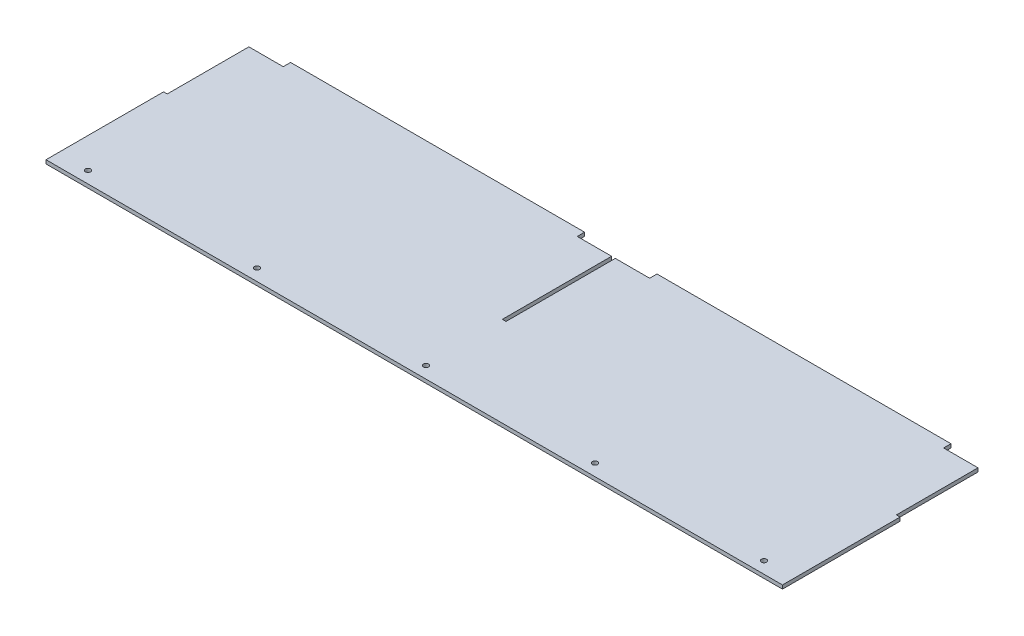
ISO-10303-21;
HEADER;
FILE_DESCRIPTION(('STEP AP214'),'2;1');
FILE_NAME('part.step','',(''),(''),'','','');
FILE_SCHEMA(('AUTOMOTIVE_DESIGN { 1 0 10303 214 1 1 1 1 }'));
ENDSEC;
DATA;
#1=APPLICATION_CONTEXT('core data for automotive mechanical design processes');
#2=APPLICATION_PROTOCOL_DEFINITION('international standard','automotive_design',2000,#1);
#3=PRODUCT_CONTEXT('',#1,'mechanical');
#4=PRODUCT('Part','Part','',(#3));
#5=PRODUCT_RELATED_PRODUCT_CATEGORY('part','',(#4));
#6=PRODUCT_DEFINITION_FORMATION('','',#4);
#7=PRODUCT_DEFINITION_CONTEXT('part definition',#1,'design');
#8=PRODUCT_DEFINITION('design','',#6,#7);
#9=PRODUCT_DEFINITION_SHAPE('','',#8);
#10=(LENGTH_UNIT() NAMED_UNIT(*) SI_UNIT(.MILLI.,.METRE.));
#11=(NAMED_UNIT(*) PLANE_ANGLE_UNIT() SI_UNIT($,.RADIAN.));
#12=(NAMED_UNIT(*) SI_UNIT($,.STERADIAN.) SOLID_ANGLE_UNIT());
#13=UNCERTAINTY_MEASURE_WITH_UNIT(LENGTH_MEASURE(1.E-05),#10,'distance_accuracy_value','');
#14=(GEOMETRIC_REPRESENTATION_CONTEXT(3) GLOBAL_UNCERTAINTY_ASSIGNED_CONTEXT((#13)) GLOBAL_UNIT_ASSIGNED_CONTEXT((#10,
#11,#12)) REPRESENTATION_CONTEXT('',''));
#15=CARTESIAN_POINT('',(0.,0.,0.));
#16=DIRECTION('',(0.,0.,1.));
#17=DIRECTION('',(1.,0.,0.));
#18=AXIS2_PLACEMENT_3D('',#15,#16,#17);
#19=CARTESIAN_POINT('',(629.90984,3.175,0.));
#20=DIRECTION('',(-1.,0.,0.));
#21=DIRECTION('',(0.,0.,-1.));
#22=AXIS2_PLACEMENT_3D('',#19,#20,#21);
#23=PLANE('',#22);
#24=DIRECTION('',(0.,0.,-1.));
#25=VECTOR('',#24,1.);
#26=CARTESIAN_POINT('',(629.90984,3.175,0.));
#27=LINE('',#26,#25);
#28=CARTESIAN_POINT('',(629.90984,3.175,-77.20584));
#29=VERTEX_POINT('',#28);
#30=CARTESIAN_POINT('',(629.90984,3.175,-147.69846));
#31=VERTEX_POINT('',#30);
#32=EDGE_CURVE('E259',#29,#31,#27,.T.);
#33=ORIENTED_EDGE('',*,*,#32,.F.);
#34=DIRECTION('',(0.,-1.,0.));
#35=VECTOR('',#34,1.);
#36=CARTESIAN_POINT('',(629.90984,3.175,-77.20584));
#37=LINE('',#36,#35);
#38=CARTESIAN_POINT('',(629.90984,0.,-77.20584));
#39=VERTEX_POINT('',#38);
#40=EDGE_CURVE('E218',#29,#39,#37,.T.);
#41=ORIENTED_EDGE('',*,*,#40,.T.);
#42=DIRECTION('',(0.,0.,-1.));
#43=VECTOR('',#42,1.);
#44=CARTESIAN_POINT('',(629.90984,0.,0.));
#45=LINE('',#44,#43);
#46=CARTESIAN_POINT('',(629.90984,0.,-147.69846));
#47=VERTEX_POINT('',#46);
#48=EDGE_CURVE('E284',#39,#47,#45,.T.);
#49=ORIENTED_EDGE('',*,*,#48,.T.);
#50=DIRECTION('',(0.,1.,0.));
#51=VECTOR('',#50,1.);
#52=CARTESIAN_POINT('',(629.90984,3.175,-147.69846));
#53=LINE('',#52,#51);
#54=EDGE_CURVE('E319',#47,#31,#53,.T.);
#55=ORIENTED_EDGE('',*,*,#54,.T.);
#56=EDGE_LOOP('',(#33,#41,#49,#55));
#57=FACE_BOUND('',#56,.T.);
#58=ADVANCED_FACE('F39',(#57),#23,.F.);
#59=CARTESIAN_POINT('',(313.36742,3.175,-53.3320399735148));
#60=DIRECTION('',(0.,0.,-1.));
#61=DIRECTION('',(1.,0.,0.));
#62=AXIS2_PLACEMENT_3D('',#59,#60,#61);
#63=PLANE('',#62);
#64=DIRECTION('',(0.,1.,0.));
#65=VECTOR('',#64,1.);
#66=CARTESIAN_POINT('',(316.54242,3.175,-53.3320399735148));
#67=LINE('',#66,#65);
#68=CARTESIAN_POINT('',(316.54242,0.,-53.3320399735148));
#69=VERTEX_POINT('',#68);
#70=CARTESIAN_POINT('',(316.54242,3.175,-53.3320399735148));
#71=VERTEX_POINT('',#70);
#72=EDGE_CURVE('E11',#69,#71,#67,.T.);
#73=ORIENTED_EDGE('',*,*,#72,.F.);
#74=DIRECTION('',(1.,0.,0.));
#75=VECTOR('',#74,1.);
#76=CARTESIAN_POINT('',(0.,0.,-53.3320399735148));
#77=LINE('',#76,#75);
#78=CARTESIAN_POINT('',(313.36742,0.,-53.3320399735148));
#79=VERTEX_POINT('',#78);
#80=EDGE_CURVE('E306',#79,#69,#77,.T.);
#81=ORIENTED_EDGE('',*,*,#80,.F.);
#82=DIRECTION('',(0.,1.,0.));
#83=VECTOR('',#82,1.);
#84=CARTESIAN_POINT('',(313.36742,3.175,-53.3320399735148));
#85=LINE('',#84,#83);
#86=CARTESIAN_POINT('',(313.36742,3.175,-53.3320399735148));
#87=VERTEX_POINT('',#86);
#88=EDGE_CURVE('E48',#79,#87,#85,.T.);
#89=ORIENTED_EDGE('',*,*,#88,.T.);
#90=DIRECTION('',(1.,0.,0.));
#91=VECTOR('',#90,1.);
#92=CARTESIAN_POINT('',(313.36742,3.175,-53.3320399735148));
#93=LINE('',#92,#91);
#94=EDGE_CURVE('E241',#87,#71,#93,.T.);
#95=ORIENTED_EDGE('',*,*,#94,.T.);
#96=EDGE_LOOP('',(#73,#81,#89,#95));
#97=FACE_BOUND('',#96,.T.);
#98=ADVANCED_FACE('F337',(#97),#63,.T.);
#99=CARTESIAN_POINT('',(313.36742,3.175,-53.3320399735148));
#100=DIRECTION('',(1.,0.,0.));
#101=DIRECTION('',(0.,0.,1.));
#102=AXIS2_PLACEMENT_3D('',#99,#100,#101);
#103=PLANE('',#102);
#104=ORIENTED_EDGE('',*,*,#88,.F.);
#105=DIRECTION('',(0.,0.,-1.));
#106=VECTOR('',#105,1.);
#107=CARTESIAN_POINT('',(313.36742,0.,0.));
#108=LINE('',#107,#106);
#109=CARTESIAN_POINT('',(313.36742,0.,-147.69846));
#110=VERTEX_POINT('',#109);
#111=EDGE_CURVE('E303',#110,#79,#108,.F.);
#112=ORIENTED_EDGE('',*,*,#111,.F.);
#113=DIRECTION('',(0.,1.,0.));
#114=VECTOR('',#113,1.);
#115=CARTESIAN_POINT('',(313.36742,3.175,-147.69846));
#116=LINE('',#115,#114);
#117=CARTESIAN_POINT('',(313.36742,3.175,-147.69846));
#118=VERTEX_POINT('',#117);
#119=EDGE_CURVE('E332',#110,#118,#116,.T.);
#120=ORIENTED_EDGE('',*,*,#119,.T.);
#121=DIRECTION('',(0.,0.,1.));
#122=VECTOR('',#121,1.);
#123=CARTESIAN_POINT('',(313.36742,3.175,-53.3320399735148));
#124=LINE('',#123,#122);
#125=EDGE_CURVE('E244',#118,#87,#124,.T.);
#126=ORIENTED_EDGE('',*,*,#125,.T.);
#127=EDGE_LOOP('',(#104,#112,#120,#126));
#128=FACE_BOUND('',#127,.T.);
#129=ADVANCED_FACE('F346',(#128),#103,.T.);
#130=CARTESIAN_POINT('',(0.,3.175,-147.69846));
#131=DIRECTION('',(0.,0.,1.));
#132=DIRECTION('',(-1.,0.,0.));
#133=AXIS2_PLACEMENT_3D('',#130,#131,#132);
#134=PLANE('',#133);
#135=ORIENTED_EDGE('',*,*,#119,.F.);
#136=DIRECTION('',(1.,0.,0.));
#137=VECTOR('',#136,1.);
#138=CARTESIAN_POINT('',(0.,0.,-147.69846));
#139=LINE('',#138,#137);
#140=CARTESIAN_POINT('',(283.68371,0.,-147.69846));
#141=VERTEX_POINT('',#140);
#142=EDGE_CURVE('E300',#110,#141,#139,.F.);
#143=ORIENTED_EDGE('',*,*,#142,.T.);
#144=DIRECTION('',(0.,1.,0.));
#145=VECTOR('',#144,1.);
#146=CARTESIAN_POINT('',(283.68371,3.175,-147.69846));
#147=LINE('',#146,#145);
#148=CARTESIAN_POINT('',(283.68371,3.175,-147.69846));
#149=VERTEX_POINT('',#148);
#150=EDGE_CURVE('E330',#141,#149,#147,.T.);
#151=ORIENTED_EDGE('',*,*,#150,.T.);
#152=DIRECTION('',(-1.,0.,0.));
#153=VECTOR('',#152,1.);
#154=CARTESIAN_POINT('',(0.,3.175,-147.69846));
#155=LINE('',#154,#153);
#156=EDGE_CURVE('E238',#118,#149,#155,.T.);
#157=ORIENTED_EDGE('',*,*,#156,.F.);
#158=EDGE_LOOP('',(#135,#143,#151,#157));
#159=FACE_BOUND('',#158,.T.);
#160=ADVANCED_FACE('F349',(#159),#134,.F.);
#161=CARTESIAN_POINT('',(283.68371,3.17499999999993,-154.04846));
#162=DIRECTION('',(1.,0.,0.));
#163=DIRECTION('',(0.,0.,1.));
#164=AXIS2_PLACEMENT_3D('',#161,#162,#163);
#165=PLANE('',#164);
#166=ORIENTED_EDGE('',*,*,#150,.F.);
#167=DIRECTION('',(0.,0.,-1.));
#168=VECTOR('',#167,1.);
#169=CARTESIAN_POINT('',(283.68371,0.,0.));
#170=LINE('',#169,#168);
#171=CARTESIAN_POINT('',(283.68371,0.,-154.04846));
#172=VERTEX_POINT('',#171);
#173=EDGE_CURVE('E297',#172,#141,#170,.F.);
#174=ORIENTED_EDGE('',*,*,#173,.F.);
#175=DIRECTION('',(0.,1.,0.));
#176=VECTOR('',#175,1.);
#177=CARTESIAN_POINT('',(283.68371,3.17499999999993,-154.04846));
#178=LINE('',#177,#176);
#179=CARTESIAN_POINT('',(283.68371,3.17499999999993,-154.04846));
#180=VERTEX_POINT('',#179);
#181=EDGE_CURVE('E328',#172,#180,#178,.T.);
#182=ORIENTED_EDGE('',*,*,#181,.T.);
#183=DIRECTION('',(0.,0.,1.));
#184=VECTOR('',#183,1.);
#185=CARTESIAN_POINT('',(283.68371,3.17499999999993,-154.04846));
#186=LINE('',#185,#184);
#187=EDGE_CURVE('E247',#180,#149,#186,.T.);
#188=ORIENTED_EDGE('',*,*,#187,.T.);
#189=EDGE_LOOP('',(#166,#174,#182,#188));
#190=FACE_BOUND('',#189,.T.);
#191=ADVANCED_FACE('F354',(#190),#165,.T.);
#192=CARTESIAN_POINT('',(283.68371,3.17499999999993,-154.04846));
#193=DIRECTION('',(0.,0.,-1.));
#194=DIRECTION('',(1.,0.,0.));
#195=AXIS2_PLACEMENT_3D('',#192,#193,#194);
#196=PLANE('',#195);
#197=ORIENTED_EDGE('',*,*,#181,.F.);
#198=DIRECTION('',(1.,0.,0.));
#199=VECTOR('',#198,1.);
#200=CARTESIAN_POINT('',(0.,0.,-154.04846));
#201=LINE('',#200,#199);
#202=CARTESIAN_POINT('',(29.6837100000001,0.,-154.04846));
#203=VERTEX_POINT('',#202);
#204=EDGE_CURVE('E294',#203,#172,#201,.T.);
#205=ORIENTED_EDGE('',*,*,#204,.F.);
#206=DIRECTION('',(0.,1.,0.));
#207=VECTOR('',#206,1.);
#208=CARTESIAN_POINT('',(29.6837100000001,3.17499999999993,-154.04846));
#209=LINE('',#208,#207);
#210=CARTESIAN_POINT('',(29.6837100000001,3.17499999999993,-154.04846));
#211=VERTEX_POINT('',#210);
#212=EDGE_CURVE('E326',#203,#211,#209,.T.);
#213=ORIENTED_EDGE('',*,*,#212,.T.);
#214=DIRECTION('',(1.,0.,0.));
#215=VECTOR('',#214,1.);
#216=CARTESIAN_POINT('',(283.68371,3.17499999999993,-154.04846));
#217=LINE('',#216,#215);
#218=EDGE_CURVE('E250',#211,#180,#217,.T.);
#219=ORIENTED_EDGE('',*,*,#218,.T.);
#220=EDGE_LOOP('',(#197,#205,#213,#219));
#221=FACE_BOUND('',#220,.T.);
#222=ADVANCED_FACE('F410',(#221),#196,.T.);
#223=CARTESIAN_POINT('',(29.6837100000001,3.17499999999993,-154.04846));
#224=DIRECTION('',(1.,0.,0.));
#225=DIRECTION('',(0.,0.,1.));
#226=AXIS2_PLACEMENT_3D('',#223,#224,#225);
#227=PLANE('',#226);
#228=ORIENTED_EDGE('',*,*,#212,.F.);
#229=DIRECTION('',(0.,0.,-1.));
#230=VECTOR('',#229,1.);
#231=CARTESIAN_POINT('',(29.6837100000001,0.,0.));
#232=LINE('',#231,#230);
#233=CARTESIAN_POINT('',(29.6837100000001,0.,-147.69846));
#234=VERTEX_POINT('',#233);
#235=EDGE_CURVE('E291',#203,#234,#232,.F.);
#236=ORIENTED_EDGE('',*,*,#235,.T.);
#237=DIRECTION('',(0.,1.,0.));
#238=VECTOR('',#237,1.);
#239=CARTESIAN_POINT('',(29.6837100000001,3.175,-147.69846));
#240=LINE('',#239,#238);
#241=CARTESIAN_POINT('',(29.6837100000001,3.175,-147.69846));
#242=VERTEX_POINT('',#241);
#243=EDGE_CURVE('E324',#234,#242,#240,.T.);
#244=ORIENTED_EDGE('',*,*,#243,.T.);
#245=DIRECTION('',(0.,0.,1.));
#246=VECTOR('',#245,1.);
#247=CARTESIAN_POINT('',(29.6837100000001,3.17499999999993,-154.04846));
#248=LINE('',#247,#246);
#249=EDGE_CURVE('E253',#211,#242,#248,.T.);
#250=ORIENTED_EDGE('',*,*,#249,.F.);
#251=EDGE_LOOP('',(#228,#236,#244,#250));
#252=FACE_BOUND('',#251,.T.);
#253=ADVANCED_FACE('F407',(#252),#227,.F.);
#254=ORIENTED_EDGE('',*,*,#243,.F.);
#255=DIRECTION('',(1.,0.,0.));
#256=VECTOR('',#255,1.);
#257=CARTESIAN_POINT('',(0.,0.,-147.69846));
#258=LINE('',#257,#256);
#259=CARTESIAN_POINT('',(0.,0.,-147.69846));
#260=VERTEX_POINT('',#259);
#261=EDGE_CURVE('E288',#234,#260,#258,.F.);
#262=ORIENTED_EDGE('',*,*,#261,.T.);
#263=DIRECTION('',(0.,1.,0.));
#264=VECTOR('',#263,1.);
#265=CARTESIAN_POINT('',(0.,3.175,-147.69846));
#266=LINE('',#265,#264);
#267=CARTESIAN_POINT('',(0.,3.175,-147.69846));
#268=VERTEX_POINT('',#267);
#269=EDGE_CURVE('E322',#260,#268,#266,.T.);
#270=ORIENTED_EDGE('',*,*,#269,.T.);
#271=EDGE_CURVE('E256',#242,#268,#155,.T.);
#272=ORIENTED_EDGE('',*,*,#271,.F.);
#273=EDGE_LOOP('',(#254,#262,#270,#272));
#274=FACE_BOUND('',#273,.T.);
#275=ADVANCED_FACE('F393',(#274),#134,.F.);
#276=CARTESIAN_POINT('',(0.,3.175,0.));
#277=DIRECTION('',(1.,0.,0.));
#278=DIRECTION('',(0.,0.,1.));
#279=AXIS2_PLACEMENT_3D('',#276,#277,#278);
#280=PLANE('',#279);
#281=DIRECTION('',(0.,-1.,0.));
#282=VECTOR('',#281,1.);
#283=CARTESIAN_POINT('',(0.,3.175,-77.20584));
#284=LINE('',#283,#282);
#285=CARTESIAN_POINT('',(0.,3.175,-77.20584));
#286=VERTEX_POINT('',#285);
#287=CARTESIAN_POINT('',(0.,0.,-77.20584));
#288=VERTEX_POINT('',#287);
#289=EDGE_CURVE('E63',#286,#288,#284,.T.);
#290=ORIENTED_EDGE('',*,*,#289,.F.);
#291=DIRECTION('',(0.,0.,1.));
#292=VECTOR('',#291,1.);
#293=CARTESIAN_POINT('',(0.,3.175,0.));
#294=LINE('',#293,#292);
#295=EDGE_CURVE('E257',#268,#286,#294,.T.);
#296=ORIENTED_EDGE('',*,*,#295,.F.);
#297=ORIENTED_EDGE('',*,*,#269,.F.);
#298=DIRECTION('',(0.,0.,-1.));
#299=VECTOR('',#298,1.);
#300=CARTESIAN_POINT('',(0.,0.,0.));
#301=LINE('',#300,#299);
#302=EDGE_CURVE('E286',#260,#288,#301,.F.);
#303=ORIENTED_EDGE('',*,*,#302,.T.);
#304=EDGE_LOOP('',(#290,#296,#297,#303));
#305=FACE_BOUND('',#304,.T.);
#306=ADVANCED_FACE('F395',(#305),#280,.F.);
#307=ORIENTED_EDGE('',*,*,#54,.F.);
#308=DIRECTION('',(1.,0.,0.));
#309=VECTOR('',#308,1.);
#310=CARTESIAN_POINT('',(0.,0.,-147.69846));
#311=LINE('',#310,#309);
#312=CARTESIAN_POINT('',(600.22613,0.,-147.69846));
#313=VERTEX_POINT('',#312);
#314=EDGE_CURVE('E281',#47,#313,#311,.F.);
#315=ORIENTED_EDGE('',*,*,#314,.T.);
#316=DIRECTION('',(0.,1.,0.));
#317=VECTOR('',#316,1.);
#318=CARTESIAN_POINT('',(600.22613,3.175,-147.69846));
#319=LINE('',#318,#317);
#320=CARTESIAN_POINT('',(600.22613,3.175,-147.69846));
#321=VERTEX_POINT('',#320);
#322=EDGE_CURVE('E317',#313,#321,#319,.T.);
#323=ORIENTED_EDGE('',*,*,#322,.T.);
#324=EDGE_CURVE('E237',#31,#321,#155,.T.);
#325=ORIENTED_EDGE('',*,*,#324,.F.);
#326=EDGE_LOOP('',(#307,#315,#323,#325));
#327=FACE_BOUND('',#326,.T.);
#328=ADVANCED_FACE('F385',(#327),#134,.F.);
#329=CARTESIAN_POINT('',(600.22613,3.17499999999993,-154.04846));
#330=DIRECTION('',(1.,0.,0.));
#331=DIRECTION('',(0.,0.,1.));
#332=AXIS2_PLACEMENT_3D('',#329,#330,#331);
#333=PLANE('',#332);
#334=ORIENTED_EDGE('',*,*,#322,.F.);
#335=DIRECTION('',(0.,0.,-1.));
#336=VECTOR('',#335,1.);
#337=CARTESIAN_POINT('',(600.22613,0.,0.));
#338=LINE('',#337,#336);
#339=CARTESIAN_POINT('',(600.22613,0.,-154.04846));
#340=VERTEX_POINT('',#339);
#341=EDGE_CURVE('E278',#340,#313,#338,.F.);
#342=ORIENTED_EDGE('',*,*,#341,.F.);
#343=DIRECTION('',(0.,1.,0.));
#344=VECTOR('',#343,1.);
#345=CARTESIAN_POINT('',(600.22613,3.17499999999993,-154.04846));
#346=LINE('',#345,#344);
#347=CARTESIAN_POINT('',(600.22613,3.17499999999993,-154.04846));
#348=VERTEX_POINT('',#347);
#349=EDGE_CURVE('E315',#340,#348,#346,.T.);
#350=ORIENTED_EDGE('',*,*,#349,.T.);
#351=DIRECTION('',(0.,0.,1.));
#352=VECTOR('',#351,1.);
#353=CARTESIAN_POINT('',(600.22613,3.17499999999993,-154.04846));
#354=LINE('',#353,#352);
#355=EDGE_CURVE('E261',#348,#321,#354,.T.);
#356=ORIENTED_EDGE('',*,*,#355,.T.);
#357=EDGE_LOOP('',(#334,#342,#350,#356));
#358=FACE_BOUND('',#357,.T.);
#359=ADVANCED_FACE('F368',(#358),#333,.T.);
#360=CARTESIAN_POINT('',(600.22613,3.17499999999993,-154.04846));
#361=DIRECTION('',(0.,0.,-1.));
#362=DIRECTION('',(1.,0.,0.));
#363=AXIS2_PLACEMENT_3D('',#360,#361,#362);
#364=PLANE('',#363);
#365=ORIENTED_EDGE('',*,*,#349,.F.);
#366=DIRECTION('',(1.,0.,0.));
#367=VECTOR('',#366,1.);
#368=CARTESIAN_POINT('',(0.,0.,-154.04846));
#369=LINE('',#368,#367);
#370=CARTESIAN_POINT('',(346.22613,0.,-154.04846));
#371=VERTEX_POINT('',#370);
#372=EDGE_CURVE('E275',#371,#340,#369,.T.);
#373=ORIENTED_EDGE('',*,*,#372,.F.);
#374=DIRECTION('',(0.,1.,0.));
#375=VECTOR('',#374,1.);
#376=CARTESIAN_POINT('',(346.22613,3.17499999999993,-154.04846));
#377=LINE('',#376,#375);
#378=CARTESIAN_POINT('',(346.22613,3.17499999999993,-154.04846));
#379=VERTEX_POINT('',#378);
#380=EDGE_CURVE('E313',#371,#379,#377,.T.);
#381=ORIENTED_EDGE('',*,*,#380,.T.);
#382=DIRECTION('',(1.,0.,0.));
#383=VECTOR('',#382,1.);
#384=CARTESIAN_POINT('',(600.22613,3.17499999999993,-154.04846));
#385=LINE('',#384,#383);
#386=EDGE_CURVE('E264',#379,#348,#385,.T.);
#387=ORIENTED_EDGE('',*,*,#386,.T.);
#388=EDGE_LOOP('',(#365,#373,#381,#387));
#389=FACE_BOUND('',#388,.T.);
#390=ADVANCED_FACE('F372',(#389),#364,.T.);
#391=CARTESIAN_POINT('',(346.22613,3.17499999999993,-154.04846));
#392=DIRECTION('',(1.,0.,0.));
#393=DIRECTION('',(0.,0.,1.));
#394=AXIS2_PLACEMENT_3D('',#391,#392,#393);
#395=PLANE('',#394);
#396=ORIENTED_EDGE('',*,*,#380,.F.);
#397=DIRECTION('',(0.,0.,-1.));
#398=VECTOR('',#397,1.);
#399=CARTESIAN_POINT('',(346.22613,0.,0.));
#400=LINE('',#399,#398);
#401=CARTESIAN_POINT('',(346.22613,0.,-147.69846));
#402=VERTEX_POINT('',#401);
#403=EDGE_CURVE('E236',#371,#402,#400,.F.);
#404=ORIENTED_EDGE('',*,*,#403,.T.);
#405=DIRECTION('',(0.,1.,0.));
#406=VECTOR('',#405,1.);
#407=CARTESIAN_POINT('',(346.22613,3.17499999999993,-147.69846));
#408=LINE('',#407,#406);
#409=CARTESIAN_POINT('',(346.22613,3.17499999999993,-147.69846));
#410=VERTEX_POINT('',#409);
#411=EDGE_CURVE('E311',#402,#410,#408,.T.);
#412=ORIENTED_EDGE('',*,*,#411,.T.);
#413=DIRECTION('',(0.,0.,1.));
#414=VECTOR('',#413,1.);
#415=CARTESIAN_POINT('',(346.22613,3.17499999999993,-154.04846));
#416=LINE('',#415,#414);
#417=EDGE_CURVE('E267',#379,#410,#416,.T.);
#418=ORIENTED_EDGE('',*,*,#417,.F.);
#419=EDGE_LOOP('',(#396,#404,#412,#418));
#420=FACE_BOUND('',#419,.T.);
#421=ADVANCED_FACE('F376',(#420),#395,.F.);
#422=ORIENTED_EDGE('',*,*,#411,.F.);
#423=DIRECTION('',(1.,0.,0.));
#424=VECTOR('',#423,1.);
#425=CARTESIAN_POINT('',(0.,0.,-147.69846));
#426=LINE('',#425,#424);
#427=CARTESIAN_POINT('',(316.54242,0.,-147.69846));
#428=VERTEX_POINT('',#427);
#429=EDGE_CURVE('E230',#402,#428,#426,.F.);
#430=ORIENTED_EDGE('',*,*,#429,.T.);
#431=DIRECTION('',(0.,1.,0.));
#432=VECTOR('',#431,1.);
#433=CARTESIAN_POINT('',(316.54242,3.175,-147.69846));
#434=LINE('',#433,#432);
#435=CARTESIAN_POINT('',(316.54242,3.175,-147.69846));
#436=VERTEX_POINT('',#435);
#437=EDGE_CURVE('E43',#428,#436,#434,.T.);
#438=ORIENTED_EDGE('',*,*,#437,.T.);
#439=EDGE_CURVE('E232',#410,#436,#155,.T.);
#440=ORIENTED_EDGE('',*,*,#439,.F.);
#441=EDGE_LOOP('',(#422,#430,#438,#440));
#442=FACE_BOUND('',#441,.T.);
#443=ADVANCED_FACE('F382',(#442),#134,.F.);
#444=CARTESIAN_POINT('',(316.54242,3.175,-53.3320399735148));
#445=DIRECTION('',(-1.,0.,0.));
#446=DIRECTION('',(0.,0.,-1.));
#447=AXIS2_PLACEMENT_3D('',#444,#445,#446);
#448=PLANE('',#447);
#449=DIRECTION('',(0.,0.,-1.));
#450=VECTOR('',#449,1.);
#451=CARTESIAN_POINT('',(316.54242,0.,0.));
#452=LINE('',#451,#450);
#453=EDGE_CURVE('E272',#69,#428,#452,.T.);
#454=ORIENTED_EDGE('',*,*,#453,.F.);
#455=ORIENTED_EDGE('',*,*,#72,.T.);
#456=DIRECTION('',(0.,0.,-1.));
#457=VECTOR('',#456,1.);
#458=CARTESIAN_POINT('',(316.54242,3.175,-53.3320399735148));
#459=LINE('',#458,#457);
#460=EDGE_CURVE('E235',#71,#436,#459,.T.);
#461=ORIENTED_EDGE('',*,*,#460,.T.);
#462=ORIENTED_EDGE('',*,*,#437,.F.);
#463=EDGE_LOOP('',(#454,#455,#461,#462));
#464=FACE_BOUND('',#463,.T.);
#465=ADVANCED_FACE('F41',(#464),#448,.T.);
#466=CARTESIAN_POINT('',(0.,3.175,0.));
#467=DIRECTION('',(0.,-1.,0.));
#468=DIRECTION('',(0.,0.,-1.));
#469=AXIS2_PLACEMENT_3D('',#466,#467,#468);
#470=PLANE('',#469);
#471=CARTESIAN_POINT('',(606.977733218917,3.175,14.2341599999992));
#472=DIRECTION('',(0.,1.,0.));
#473=DIRECTION('',(0.,0.,1.));
#474=AXIS2_PLACEMENT_3D('',#471,#472,#473);
#475=CIRCLE('',#474,2.25000000000001);
#476=CARTESIAN_POINT('',(606.977733218917,3.175,16.4841599999992));
#477=VERTEX_POINT('',#476);
#478=EDGE_CURVE('E742',#477,#477,#475,.T.);
#479=ORIENTED_EDGE('',*,*,#478,.F.);
#480=EDGE_LOOP('',(#479));
#481=FACE_BOUND('',#480,.T.);
#482=CARTESIAN_POINT('',(460.966326609485,3.175,14.2341600000001));
#483=DIRECTION('',(0.,1.,0.));
#484=DIRECTION('',(0.,0.,1.));
#485=AXIS2_PLACEMENT_3D('',#482,#483,#484);
#486=CIRCLE('',#485,2.24999999999995);
#487=CARTESIAN_POINT('',(460.966326609485,3.175,16.48416));
#488=VERTEX_POINT('',#487);
#489=EDGE_CURVE('E746',#488,#488,#486,.T.);
#490=ORIENTED_EDGE('',*,*,#489,.F.);
#491=EDGE_LOOP('',(#490));
#492=FACE_BOUND('',#491,.T.);
#493=CARTESIAN_POINT('',(314.95492,3.175,14.2341600000001));
#494=DIRECTION('',(0.,1.,0.));
#495=DIRECTION('',(0.,0.,1.));
#496=AXIS2_PLACEMENT_3D('',#493,#494,#495);
#497=CIRCLE('',#496,2.24999999999995);
#498=CARTESIAN_POINT('',(314.95492,3.175,16.48416));
#499=VERTEX_POINT('',#498);
#500=EDGE_CURVE('E750',#499,#499,#497,.T.);
#501=ORIENTED_EDGE('',*,*,#500,.F.);
#502=EDGE_LOOP('',(#501));
#503=FACE_BOUND('',#502,.T.);
#504=CARTESIAN_POINT('',(168.943513390621,3.175,14.2341600000021));
#505=DIRECTION('',(0.,1.,0.));
#506=DIRECTION('',(0.,0.,1.));
#507=AXIS2_PLACEMENT_3D('',#504,#505,#506);
#508=CIRCLE('',#507,2.25000000000001);
#509=CARTESIAN_POINT('',(168.943513390621,3.175,16.4841600000021));
#510=VERTEX_POINT('',#509);
#511=EDGE_CURVE('E754',#510,#510,#508,.T.);
#512=ORIENTED_EDGE('',*,*,#511,.F.);
#513=EDGE_LOOP('',(#512));
#514=FACE_BOUND('',#513,.T.);
#515=CARTESIAN_POINT('',(22.9321067811893,3.175,14.2341600000031));
#516=DIRECTION('',(0.,1.,0.));
#517=DIRECTION('',(0.,0.,1.));
#518=AXIS2_PLACEMENT_3D('',#515,#516,#517);
#519=CIRCLE('',#518,2.25);
#520=CARTESIAN_POINT('',(22.9321067811893,3.175,16.4841600000031));
#521=VERTEX_POINT('',#520);
#522=EDGE_CURVE('E209',#521,#521,#519,.T.);
#523=ORIENTED_EDGE('',*,*,#522,.F.);
#524=EDGE_LOOP('',(#523));
#525=FACE_BOUND('',#524,.T.);
#526=ORIENTED_EDGE('',*,*,#439,.T.);
#527=ORIENTED_EDGE('',*,*,#460,.F.);
#528=ORIENTED_EDGE('',*,*,#94,.F.);
#529=ORIENTED_EDGE('',*,*,#125,.F.);
#530=ORIENTED_EDGE('',*,*,#156,.T.);
#531=ORIENTED_EDGE('',*,*,#187,.F.);
#532=ORIENTED_EDGE('',*,*,#218,.F.);
#533=ORIENTED_EDGE('',*,*,#249,.T.);
#534=ORIENTED_EDGE('',*,*,#271,.T.);
#535=ORIENTED_EDGE('',*,*,#295,.T.);
#536=DIRECTION('',(1.,0.,0.));
#537=VECTOR('',#536,1.);
#538=CARTESIAN_POINT('',(0.,3.175,-77.20584));
#539=LINE('',#538,#537);
#540=CARTESIAN_POINT('',(-3.175,3.175,-77.20584));
#541=VERTEX_POINT('',#540);
#542=EDGE_CURVE('E225',#541,#286,#539,.T.);
#543=ORIENTED_EDGE('',*,*,#542,.F.);
#544=DIRECTION('',(0.,0.,-1.));
#545=VECTOR('',#544,1.);
#546=CARTESIAN_POINT('',(-3.175,3.175,-77.20584));
#547=LINE('',#546,#545);
#548=CARTESIAN_POINT('',(-3.175,3.175,24.39416));
#549=VERTEX_POINT('',#548);
#550=EDGE_CURVE('E223',#549,#541,#547,.T.);
#551=ORIENTED_EDGE('',*,*,#550,.F.);
#552=DIRECTION('',(1.,0.,0.));
#553=VECTOR('',#552,1.);
#554=CARTESIAN_POINT('',(-3.175,3.175,24.39416));
#555=LINE('',#554,#553);
#556=CARTESIAN_POINT('',(633.08484,3.175,24.39416));
#557=VERTEX_POINT('',#556);
#558=EDGE_CURVE('E197',#549,#557,#555,.T.);
#559=ORIENTED_EDGE('',*,*,#558,.T.);
#560=DIRECTION('',(0.,0.,1.));
#561=VECTOR('',#560,1.);
#562=CARTESIAN_POINT('',(633.08484,3.175,0.));
#563=LINE('',#562,#561);
#564=CARTESIAN_POINT('',(633.08484,3.175,-77.20584));
#565=VERTEX_POINT('',#564);
#566=EDGE_CURVE('E216',#565,#557,#563,.T.);
#567=ORIENTED_EDGE('',*,*,#566,.F.);
#568=DIRECTION('',(1.,0.,0.));
#569=VECTOR('',#568,1.);
#570=CARTESIAN_POINT('',(629.90984,3.175,-77.20584));
#571=LINE('',#570,#569);
#572=EDGE_CURVE('E213',#29,#565,#571,.T.);
#573=ORIENTED_EDGE('',*,*,#572,.F.);
#574=ORIENTED_EDGE('',*,*,#32,.T.);
#575=ORIENTED_EDGE('',*,*,#324,.T.);
#576=ORIENTED_EDGE('',*,*,#355,.F.);
#577=ORIENTED_EDGE('',*,*,#386,.F.);
#578=ORIENTED_EDGE('',*,*,#417,.T.);
#579=EDGE_LOOP('',(#526,#527,#528,#529,#530,#531,#532,#533,#534,#535,#543,#551,#559,#567,#573,
#574,#575,#576,#577,#578));
#580=FACE_BOUND('',#579,.T.);
#581=ADVANCED_FACE('F343',(#481,#492,#503,#514,#525,#580),#470,.F.);
#582=CARTESIAN_POINT('',(0.,0.,0.));
#583=DIRECTION('',(0.,-1.,0.));
#584=DIRECTION('',(0.,0.,-1.));
#585=AXIS2_PLACEMENT_3D('',#582,#583,#584);
#586=PLANE('',#585);
#587=CARTESIAN_POINT('',(606.977733218917,0.,14.2341599999992));
#588=DIRECTION('',(0.,1.,0.));
#589=DIRECTION('',(0.,0.,1.));
#590=AXIS2_PLACEMENT_3D('',#587,#588,#589);
#591=CIRCLE('',#590,2.25000000000001);
#592=CARTESIAN_POINT('',(606.977733218917,0.,16.4841599999992));
#593=VERTEX_POINT('',#592);
#594=EDGE_CURVE('E206',#593,#593,#591,.T.);
#595=ORIENTED_EDGE('',*,*,#594,.T.);
#596=EDGE_LOOP('',(#595));
#597=FACE_BOUND('',#596,.T.);
#598=CARTESIAN_POINT('',(460.966326609485,0.,14.2341600000001));
#599=DIRECTION('',(0.,1.,0.));
#600=DIRECTION('',(0.,0.,1.));
#601=AXIS2_PLACEMENT_3D('',#598,#599,#600);
#602=CIRCLE('',#601,2.24999999999995);
#603=CARTESIAN_POINT('',(460.966326609485,0.,16.48416));
#604=VERTEX_POINT('',#603);
#605=EDGE_CURVE('E772',#604,#604,#602,.T.);
#606=ORIENTED_EDGE('',*,*,#605,.T.);
#607=EDGE_LOOP('',(#606));
#608=FACE_BOUND('',#607,.T.);
#609=CARTESIAN_POINT('',(314.95492,0.,14.2341600000001));
#610=DIRECTION('',(0.,1.,0.));
#611=DIRECTION('',(0.,0.,1.));
#612=AXIS2_PLACEMENT_3D('',#609,#610,#611);
#613=CIRCLE('',#612,2.24999999999995);
#614=CARTESIAN_POINT('',(314.95492,0.,16.48416));
#615=VERTEX_POINT('',#614);
#616=EDGE_CURVE('E768',#615,#615,#613,.T.);
#617=ORIENTED_EDGE('',*,*,#616,.T.);
#618=EDGE_LOOP('',(#617));
#619=FACE_BOUND('',#618,.T.);
#620=CARTESIAN_POINT('',(168.943513390621,0.,14.2341600000021));
#621=DIRECTION('',(0.,1.,0.));
#622=DIRECTION('',(0.,0.,1.));
#623=AXIS2_PLACEMENT_3D('',#620,#621,#622);
#624=CIRCLE('',#623,2.25000000000001);
#625=CARTESIAN_POINT('',(168.943513390621,0.,16.4841600000021));
#626=VERTEX_POINT('',#625);
#627=EDGE_CURVE('E762',#626,#626,#624,.T.);
#628=ORIENTED_EDGE('',*,*,#627,.T.);
#629=EDGE_LOOP('',(#628));
#630=FACE_BOUND('',#629,.T.);
#631=CARTESIAN_POINT('',(22.9321067811893,0.,14.2341600000031));
#632=DIRECTION('',(0.,1.,0.));
#633=DIRECTION('',(0.,0.,1.));
#634=AXIS2_PLACEMENT_3D('',#631,#632,#633);
#635=CIRCLE('',#634,2.25);
#636=CARTESIAN_POINT('',(22.9321067811893,0.,16.4841600000031));
#637=VERTEX_POINT('',#636);
#638=EDGE_CURVE('E758',#637,#637,#635,.T.);
#639=ORIENTED_EDGE('',*,*,#638,.T.);
#640=EDGE_LOOP('',(#639));
#641=FACE_BOUND('',#640,.T.);
#642=ORIENTED_EDGE('',*,*,#429,.F.);
#643=ORIENTED_EDGE('',*,*,#403,.F.);
#644=ORIENTED_EDGE('',*,*,#372,.T.);
#645=ORIENTED_EDGE('',*,*,#341,.T.);
#646=ORIENTED_EDGE('',*,*,#314,.F.);
#647=ORIENTED_EDGE('',*,*,#48,.F.);
#648=DIRECTION('',(1.,0.,0.));
#649=VECTOR('',#648,1.);
#650=CARTESIAN_POINT('',(629.90984,0.,-77.20584));
#651=LINE('',#650,#649);
#652=CARTESIAN_POINT('',(633.08484,0.,-77.20584));
#653=VERTEX_POINT('',#652);
#654=EDGE_CURVE('E55',#39,#653,#651,.T.);
#655=ORIENTED_EDGE('',*,*,#654,.T.);
#656=DIRECTION('',(0.,0.,1.));
#657=VECTOR('',#656,1.);
#658=CARTESIAN_POINT('',(633.08484,0.,0.));
#659=LINE('',#658,#657);
#660=CARTESIAN_POINT('',(633.08484,0.,24.39416));
#661=VERTEX_POINT('',#660);
#662=EDGE_CURVE('E203',#653,#661,#659,.T.);
#663=ORIENTED_EDGE('',*,*,#662,.T.);
#664=DIRECTION('',(1.,0.,0.));
#665=VECTOR('',#664,1.);
#666=CARTESIAN_POINT('',(-3.175,0.,24.39416));
#667=LINE('',#666,#665);
#668=CARTESIAN_POINT('',(-3.175,0.,24.39416));
#669=VERTEX_POINT('',#668);
#670=EDGE_CURVE('E195',#669,#661,#667,.T.);
#671=ORIENTED_EDGE('',*,*,#670,.F.);
#672=DIRECTION('',(0.,0.,-1.));
#673=VECTOR('',#672,1.);
#674=CARTESIAN_POINT('',(-3.175,0.,-77.20584));
#675=LINE('',#674,#673);
#676=CARTESIAN_POINT('',(-3.175,0.,-77.20584));
#677=VERTEX_POINT('',#676);
#678=EDGE_CURVE('E177',#669,#677,#675,.T.);
#679=ORIENTED_EDGE('',*,*,#678,.T.);
#680=DIRECTION('',(1.,0.,0.));
#681=VECTOR('',#680,1.);
#682=CARTESIAN_POINT('',(0.,0.,-77.20584));
#683=LINE('',#682,#681);
#684=EDGE_CURVE('E188',#677,#288,#683,.T.);
#685=ORIENTED_EDGE('',*,*,#684,.T.);
#686=ORIENTED_EDGE('',*,*,#302,.F.);
#687=ORIENTED_EDGE('',*,*,#261,.F.);
#688=ORIENTED_EDGE('',*,*,#235,.F.);
#689=ORIENTED_EDGE('',*,*,#204,.T.);
#690=ORIENTED_EDGE('',*,*,#173,.T.);
#691=ORIENTED_EDGE('',*,*,#142,.F.);
#692=ORIENTED_EDGE('',*,*,#111,.T.);
#693=ORIENTED_EDGE('',*,*,#80,.T.);
#694=ORIENTED_EDGE('',*,*,#453,.T.);
#695=EDGE_LOOP('',(#642,#643,#644,#645,#646,#647,#655,#663,#671,#679,#685,#686,#687,#688,#689,
#690,#691,#692,#693,#694));
#696=FACE_BOUND('',#695,.T.);
#697=ADVANCED_FACE('F201',(#597,#608,#619,#630,#641,#696),#586,.T.);
#698=CARTESIAN_POINT('',(0.,3.175,-77.20584));
#699=DIRECTION('',(0.,0.,-1.));
#700=DIRECTION('',(-1.,0.,0.));
#701=AXIS2_PLACEMENT_3D('',#698,#699,#700);
#702=PLANE('',#701);
#703=ORIENTED_EDGE('',*,*,#684,.F.);
#704=DIRECTION('',(0.,-1.,0.));
#705=VECTOR('',#704,1.);
#706=CARTESIAN_POINT('',(-3.175,3.175,-77.20584));
#707=LINE('',#706,#705);
#708=EDGE_CURVE('E183',#541,#677,#707,.T.);
#709=ORIENTED_EDGE('',*,*,#708,.F.);
#710=ORIENTED_EDGE('',*,*,#542,.T.);
#711=ORIENTED_EDGE('',*,*,#289,.T.);
#712=EDGE_LOOP('',(#703,#709,#710,#711));
#713=FACE_BOUND('',#712,.T.);
#714=ADVANCED_FACE('F564',(#713),#702,.T.);
#715=CARTESIAN_POINT('',(-3.175,3.175,-77.20584));
#716=DIRECTION('',(-1.,0.,0.));
#717=DIRECTION('',(0.,0.,1.));
#718=AXIS2_PLACEMENT_3D('',#715,#716,#717);
#719=PLANE('',#718);
#720=ORIENTED_EDGE('',*,*,#678,.F.);
#721=DIRECTION('',(0.,1.,0.));
#722=VECTOR('',#721,1.);
#723=CARTESIAN_POINT('',(-3.175,0.,24.39416));
#724=LINE('',#723,#722);
#725=EDGE_CURVE('E181',#669,#549,#724,.T.);
#726=ORIENTED_EDGE('',*,*,#725,.T.);
#727=ORIENTED_EDGE('',*,*,#550,.T.);
#728=ORIENTED_EDGE('',*,*,#708,.T.);
#729=EDGE_LOOP('',(#720,#726,#727,#728));
#730=FACE_BOUND('',#729,.T.);
#731=ADVANCED_FACE('F179',(#730),#719,.T.);
#732=CARTESIAN_POINT('',(633.08484,3.175,0.));
#733=DIRECTION('',(1.,0.,0.));
#734=DIRECTION('',(0.,0.,-1.));
#735=AXIS2_PLACEMENT_3D('',#732,#733,#734);
#736=PLANE('',#735);
#737=ORIENTED_EDGE('',*,*,#662,.F.);
#738=DIRECTION('',(0.,-1.,0.));
#739=VECTOR('',#738,1.);
#740=CARTESIAN_POINT('',(633.08484,3.175,-77.20584));
#741=LINE('',#740,#739);
#742=EDGE_CURVE('E189',#565,#653,#741,.T.);
#743=ORIENTED_EDGE('',*,*,#742,.F.);
#744=ORIENTED_EDGE('',*,*,#566,.T.);
#745=DIRECTION('',(0.,1.,0.));
#746=VECTOR('',#745,1.);
#747=CARTESIAN_POINT('',(633.08484,0.,24.39416));
#748=LINE('',#747,#746);
#749=EDGE_CURVE('E198',#661,#557,#748,.T.);
#750=ORIENTED_EDGE('',*,*,#749,.F.);
#751=EDGE_LOOP('',(#737,#743,#744,#750));
#752=FACE_BOUND('',#751,.T.);
#753=ADVANCED_FACE('F593',(#752),#736,.T.);
#754=CARTESIAN_POINT('',(629.90984,3.175,-77.20584));
#755=DIRECTION('',(0.,0.,-1.));
#756=DIRECTION('',(-1.,0.,0.));
#757=AXIS2_PLACEMENT_3D('',#754,#755,#756);
#758=PLANE('',#757);
#759=ORIENTED_EDGE('',*,*,#654,.F.);
#760=ORIENTED_EDGE('',*,*,#40,.F.);
#761=ORIENTED_EDGE('',*,*,#572,.T.);
#762=ORIENTED_EDGE('',*,*,#742,.T.);
#763=EDGE_LOOP('',(#759,#760,#761,#762));
#764=FACE_BOUND('',#763,.T.);
#765=ADVANCED_FACE('F586',(#764),#758,.T.);
#766=CARTESIAN_POINT('',(-3.175,0.,24.39416));
#767=DIRECTION('',(0.,0.,1.));
#768=DIRECTION('',(1.,0.,0.));
#769=AXIS2_PLACEMENT_3D('',#766,#767,#768);
#770=PLANE('',#769);
#771=ORIENTED_EDGE('',*,*,#558,.F.);
#772=ORIENTED_EDGE('',*,*,#725,.F.);
#773=ORIENTED_EDGE('',*,*,#670,.T.);
#774=ORIENTED_EDGE('',*,*,#749,.T.);
#775=EDGE_LOOP('',(#771,#772,#773,#774));
#776=FACE_BOUND('',#775,.T.);
#777=ADVANCED_FACE('F193',(#776),#770,.T.);
#778=CARTESIAN_POINT('',(22.9321067811893,0.,14.2341600000031));
#779=DIRECTION('',(0.,1.,0.));
#780=DIRECTION('',(0.,0.,1.));
#781=AXIS2_PLACEMENT_3D('',#778,#779,#780);
#782=CYLINDRICAL_SURFACE('',#781,2.25);
#783=ORIENTED_EDGE('',*,*,#638,.F.);
#784=EDGE_LOOP('',(#783));
#785=FACE_BOUND('',#784,.T.);
#786=ORIENTED_EDGE('',*,*,#522,.T.);
#787=EDGE_LOOP('',(#786));
#788=FACE_BOUND('',#787,.T.);
#789=ADVANCED_FACE('F498',(#785,#788),#782,.F.);
#790=CARTESIAN_POINT('',(168.943513390621,0.,14.2341600000021));
#791=DIRECTION('',(0.,1.,0.));
#792=DIRECTION('',(0.,0.,1.));
#793=AXIS2_PLACEMENT_3D('',#790,#791,#792);
#794=CYLINDRICAL_SURFACE('',#793,2.25000000000001);
#795=ORIENTED_EDGE('',*,*,#627,.F.);
#796=EDGE_LOOP('',(#795));
#797=FACE_BOUND('',#796,.T.);
#798=ORIENTED_EDGE('',*,*,#511,.T.);
#799=EDGE_LOOP('',(#798));
#800=FACE_BOUND('',#799,.T.);
#801=ADVANCED_FACE('F503',(#797,#800),#794,.F.);
#802=CARTESIAN_POINT('',(314.95492,0.,14.2341600000001));
#803=DIRECTION('',(0.,1.,0.));
#804=DIRECTION('',(0.,0.,1.));
#805=AXIS2_PLACEMENT_3D('',#802,#803,#804);
#806=CYLINDRICAL_SURFACE('',#805,2.24999999999995);
#807=ORIENTED_EDGE('',*,*,#616,.F.);
#808=EDGE_LOOP('',(#807));
#809=FACE_BOUND('',#808,.T.);
#810=ORIENTED_EDGE('',*,*,#500,.T.);
#811=EDGE_LOOP('',(#810));
#812=FACE_BOUND('',#811,.T.);
#813=ADVANCED_FACE('F514',(#809,#812),#806,.F.);
#814=CARTESIAN_POINT('',(460.966326609485,0.,14.2341600000001));
#815=DIRECTION('',(0.,1.,0.));
#816=DIRECTION('',(0.,0.,1.));
#817=AXIS2_PLACEMENT_3D('',#814,#815,#816);
#818=CYLINDRICAL_SURFACE('',#817,2.24999999999995);
#819=ORIENTED_EDGE('',*,*,#605,.F.);
#820=EDGE_LOOP('',(#819));
#821=FACE_BOUND('',#820,.T.);
#822=ORIENTED_EDGE('',*,*,#489,.T.);
#823=EDGE_LOOP('',(#822));
#824=FACE_BOUND('',#823,.T.);
#825=ADVANCED_FACE('F524',(#821,#824),#818,.F.);
#826=CARTESIAN_POINT('',(606.977733218917,0.,14.2341599999992));
#827=DIRECTION('',(0.,1.,0.));
#828=DIRECTION('',(0.,0.,1.));
#829=AXIS2_PLACEMENT_3D('',#826,#827,#828);
#830=CYLINDRICAL_SURFACE('',#829,2.25000000000001);
#831=ORIENTED_EDGE('',*,*,#594,.F.);
#832=EDGE_LOOP('',(#831));
#833=FACE_BOUND('',#832,.T.);
#834=ORIENTED_EDGE('',*,*,#478,.T.);
#835=EDGE_LOOP('',(#834));
#836=FACE_BOUND('',#835,.T.);
#837=ADVANCED_FACE('F534',(#833,#836),#830,.F.);
#838=CLOSED_SHELL('',(#58,#98,#129,#160,#191,#222,#253,#275,#306,#328,#359,#390,#421,#443,#465,
#581,#697,#714,#731,#753,#765,#777,#789,#801,#813,#825,#837));
#839=MANIFOLD_SOLID_BREP('B2',#838);
#840=ADVANCED_BREP_SHAPE_REPRESENTATION('',(#18,#839),#14);
#841=SHAPE_DEFINITION_REPRESENTATION(#9,#840);
ENDSEC;
END-ISO-10303-21;
